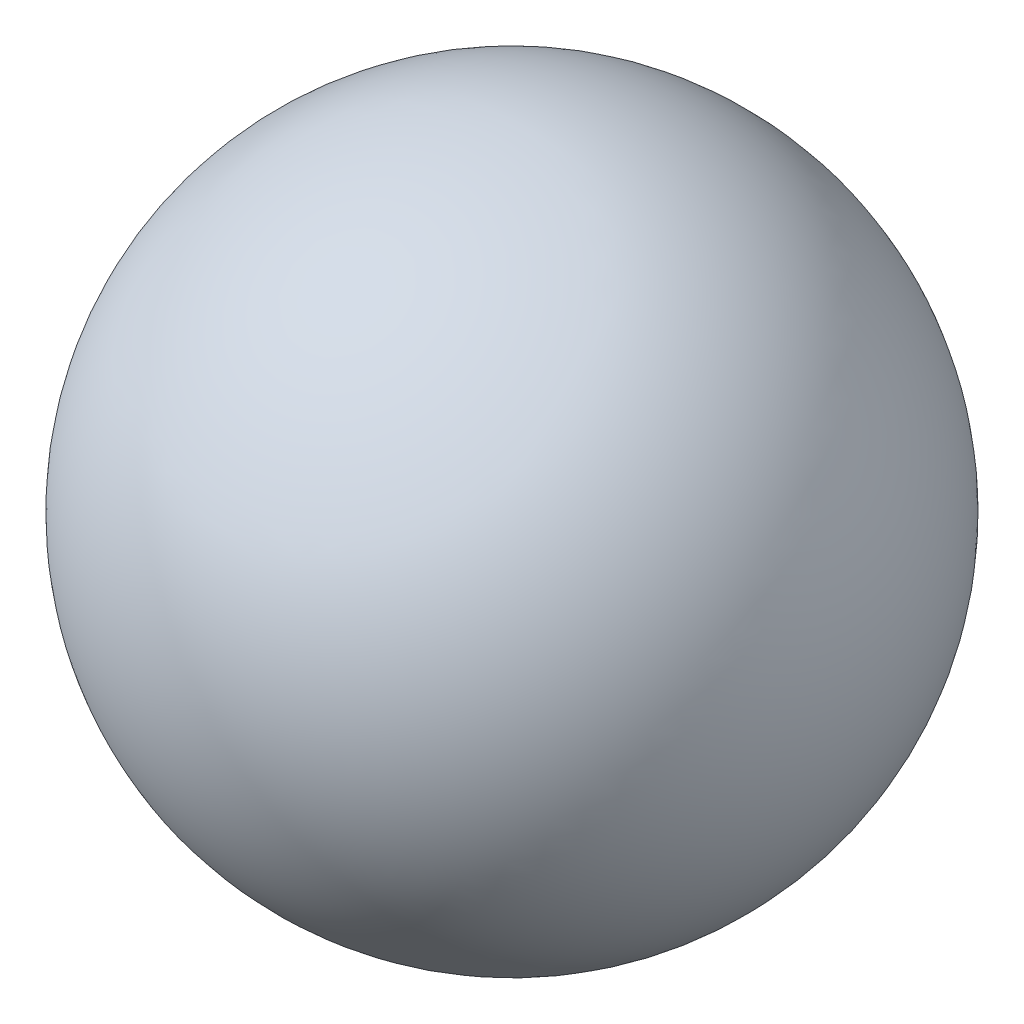
ISO-10303-21;
HEADER;
FILE_DESCRIPTION(('STEP AP214'),'2;1');
FILE_NAME('part.step','',(''),(''),'','','');
FILE_SCHEMA(('AUTOMOTIVE_DESIGN { 1 0 10303 214 1 1 1 1 }'));
ENDSEC;
DATA;
#1=APPLICATION_CONTEXT('core data for automotive mechanical design processes');
#2=APPLICATION_PROTOCOL_DEFINITION('international standard','automotive_design',2000,#1);
#3=PRODUCT_CONTEXT('',#1,'mechanical');
#4=PRODUCT('Part','Part','',(#3));
#5=PRODUCT_RELATED_PRODUCT_CATEGORY('part','',(#4));
#6=PRODUCT_DEFINITION_FORMATION('','',#4);
#7=PRODUCT_DEFINITION_CONTEXT('part definition',#1,'design');
#8=PRODUCT_DEFINITION('design','',#6,#7);
#9=PRODUCT_DEFINITION_SHAPE('','',#8);
#10=(LENGTH_UNIT() NAMED_UNIT(*) SI_UNIT(.MILLI.,.METRE.));
#11=(NAMED_UNIT(*) PLANE_ANGLE_UNIT() SI_UNIT($,.RADIAN.));
#12=(NAMED_UNIT(*) SI_UNIT($,.STERADIAN.) SOLID_ANGLE_UNIT());
#13=UNCERTAINTY_MEASURE_WITH_UNIT(LENGTH_MEASURE(1.E-05),#10,'distance_accuracy_value','');
#14=(GEOMETRIC_REPRESENTATION_CONTEXT(3) GLOBAL_UNCERTAINTY_ASSIGNED_CONTEXT((#13)) GLOBAL_UNIT_ASSIGNED_CONTEXT((#10,
#11,#12)) REPRESENTATION_CONTEXT('',''));
#15=CARTESIAN_POINT('',(0.,0.,0.));
#16=DIRECTION('',(0.,0.,1.));
#17=DIRECTION('',(1.,0.,0.));
#18=AXIS2_PLACEMENT_3D('',#15,#16,#17);
#19=CARTESIAN_POINT('',(0.,0.,-5.));
#20=DIRECTION('',(0.,0.,-1.));
#21=DIRECTION('',(1.,0.,0.));
#22=AXIS2_PLACEMENT_3D('',#19,#20,#21);
#23=SPHERICAL_SURFACE('',#22,5.);
#24=CARTESIAN_POINT('',(0.,0.,-9.5));
#25=DIRECTION('',(0.,0.,-1.));
#26=DIRECTION('',(-1.,0.,0.));
#27=AXIS2_PLACEMENT_3D('',#24,#25,#26);
#28=CIRCLE('',#27,2.17944947177033);
#29=CARTESIAN_POINT('',(-2.17944947177033,0.,-9.5));
#30=VERTEX_POINT('',#29);
#31=EDGE_CURVE('E11',#30,#30,#28,.T.);
#32=ORIENTED_EDGE('',*,*,#31,.F.);
#33=EDGE_LOOP('',(#32));
#34=FACE_BOUND('',#33,.T.);
#35=ADVANCED_FACE('F39',(#34),#23,.T.);
#36=CARTESIAN_POINT('',(2.17944947177033,0.,-9.5));
#37=DIRECTION('',(0.,0.,1.));
#38=DIRECTION('',(1.,0.,0.));
#39=AXIS2_PLACEMENT_3D('',#36,#37,#38);
#40=PLANE('',#39);
#41=CARTESIAN_POINT('',(0.,0.,-9.5));
#42=DIRECTION('',(0.,0.,-1.));
#43=DIRECTION('',(-1.,0.,0.));
#44=AXIS2_PLACEMENT_3D('',#41,#42,#43);
#45=CIRCLE('',#44,1.65);
#46=CARTESIAN_POINT('',(-1.65,0.,-9.5));
#47=VERTEX_POINT('',#46);
#48=EDGE_CURVE('E57',#47,#47,#45,.T.);
#49=ORIENTED_EDGE('',*,*,#48,.F.);
#50=EDGE_LOOP('',(#49));
#51=FACE_BOUND('',#50,.T.);
#52=ORIENTED_EDGE('',*,*,#31,.T.);
#53=EDGE_LOOP('',(#52));
#54=FACE_BOUND('',#53,.T.);
#55=ADVANCED_FACE('F52',(#51,#54),#40,.F.);
#56=CARTESIAN_POINT('',(0.,0.,-4.5));
#57=DIRECTION('',(0.,0.,-1.));
#58=DIRECTION('',(-1.,0.,0.));
#59=AXIS2_PLACEMENT_3D('',#56,#57,#58);
#60=CONICAL_SURFACE('',#59,1.65,1.02974425867665);
#61=CARTESIAN_POINT('',(0.,0.,-3.50857997860453));
#62=VERTEX_POINT('',#61);
#63=VERTEX_LOOP('',#62);
#64=FACE_BOUND('',#63,.T.);
#65=CARTESIAN_POINT('',(0.,0.,-4.5));
#66=DIRECTION('',(0.,0.,-1.));
#67=DIRECTION('',(-1.,0.,0.));
#68=AXIS2_PLACEMENT_3D('',#65,#66,#67);
#69=CIRCLE('',#68,1.65);
#70=CARTESIAN_POINT('',(-1.65,0.,-4.5));
#71=VERTEX_POINT('',#70);
#72=EDGE_CURVE('E45',#71,#71,#69,.T.);
#73=ORIENTED_EDGE('',*,*,#72,.T.);
#74=EDGE_LOOP('',(#73));
#75=FACE_BOUND('',#74,.T.);
#76=ADVANCED_FACE('F48',(#64,#75),#60,.F.);
#77=CARTESIAN_POINT('',(0.,0.,-9.5));
#78=DIRECTION('',(0.,0.,-1.));
#79=DIRECTION('',(-1.,0.,0.));
#80=AXIS2_PLACEMENT_3D('',#77,#78,#79);
#81=CYLINDRICAL_SURFACE('',#80,1.65);
#82=ORIENTED_EDGE('',*,*,#72,.F.);
#83=EDGE_LOOP('',(#82));
#84=FACE_BOUND('',#83,.T.);
#85=ORIENTED_EDGE('',*,*,#48,.T.);
#86=EDGE_LOOP('',(#85));
#87=FACE_BOUND('',#86,.T.);
#88=ADVANCED_FACE('F51',(#84,#87),#81,.F.);
#89=CLOSED_SHELL('',(#35,#55,#76,#88));
#90=MANIFOLD_SOLID_BREP('B2',#89);
#91=ADVANCED_BREP_SHAPE_REPRESENTATION('',(#18,#90),#14);
#92=SHAPE_DEFINITION_REPRESENTATION(#9,#91);
ENDSEC;
END-ISO-10303-21;
